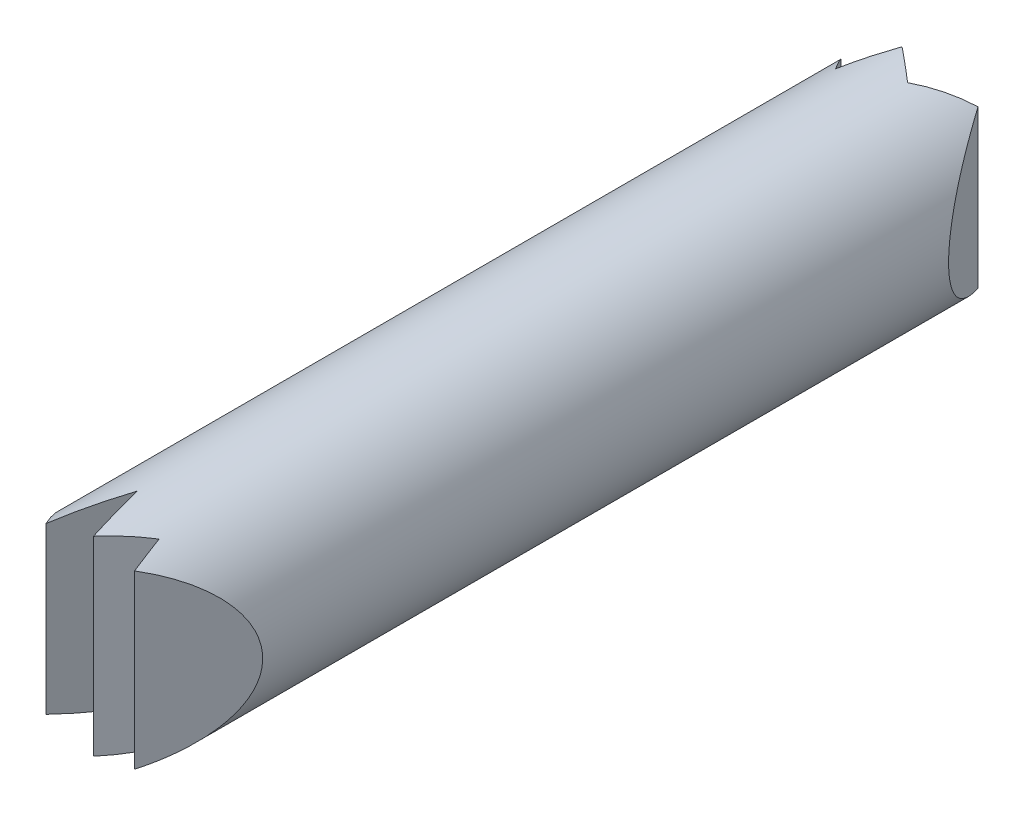
ISO-10303-21;
HEADER;
FILE_DESCRIPTION(('STEP AP214'),'2;1');
FILE_NAME('part.step','',(''),(''),'','','');
FILE_SCHEMA(('AUTOMOTIVE_DESIGN { 1 0 10303 214 1 1 1 1 }'));
ENDSEC;
DATA;
#1=APPLICATION_CONTEXT('core data for automotive mechanical design processes');
#2=APPLICATION_PROTOCOL_DEFINITION('international standard','automotive_design',2000,#1);
#3=PRODUCT_CONTEXT('',#1,'mechanical');
#4=PRODUCT('Part','Part','',(#3));
#5=PRODUCT_RELATED_PRODUCT_CATEGORY('part','',(#4));
#6=PRODUCT_DEFINITION_FORMATION('','',#4);
#7=PRODUCT_DEFINITION_CONTEXT('part definition',#1,'design');
#8=PRODUCT_DEFINITION('design','',#6,#7);
#9=PRODUCT_DEFINITION_SHAPE('','',#8);
#10=(LENGTH_UNIT() NAMED_UNIT(*) SI_UNIT(.MILLI.,.METRE.));
#11=(NAMED_UNIT(*) PLANE_ANGLE_UNIT() SI_UNIT($,.RADIAN.));
#12=(NAMED_UNIT(*) SI_UNIT($,.STERADIAN.) SOLID_ANGLE_UNIT());
#13=UNCERTAINTY_MEASURE_WITH_UNIT(LENGTH_MEASURE(1.E-05),#10,'distance_accuracy_value','');
#14=(GEOMETRIC_REPRESENTATION_CONTEXT(3) GLOBAL_UNCERTAINTY_ASSIGNED_CONTEXT((#13)) GLOBAL_UNIT_ASSIGNED_CONTEXT((#10,
#11,#12)) REPRESENTATION_CONTEXT('',''));
#15=CARTESIAN_POINT('',(0.,0.,0.));
#16=DIRECTION('',(0.,0.,1.));
#17=DIRECTION('',(1.,0.,0.));
#18=AXIS2_PLACEMENT_3D('',#15,#16,#17);
#19=CARTESIAN_POINT('',(-1.17875178837804,-5.,1.28429149256794));
#20=DIRECTION('',(0.887354961117826,0.,0.461086947309921));
#21=DIRECTION('',(0.461086947309921,0.,-0.887354961117826));
#22=AXIS2_PLACEMENT_3D('',#19,#20,#21);
#23=PLANE('',#22);
#24=CARTESIAN_POINT('',(0.,0.,-0.984198763871083));
#25=DIRECTION('',(0.887354961117826,0.,0.461086947309921));
#26=DIRECTION('',(-0.461086947309921,0.,0.887354961117826));
#27=AXIS2_PLACEMENT_3D('',#24,#25,#26);
#28=ELLIPSE('',#27,5.42197087682818,2.5);
#29=CARTESIAN_POINT('',(-1.17875178837804,-2.20466419696868,1.28429149256793));
#30=VERTEX_POINT('',#29);
#31=CARTESIAN_POINT('',(-0.583899881436,-2.43085600734783,0.139507859383393));
#32=VERTEX_POINT('',#31);
#33=EDGE_CURVE('E105',#30,#32,#28,.T.);
#34=ORIENTED_EDGE('',*,*,#33,.F.);
#35=DIRECTION('',(0.,1.,0.));
#36=VECTOR('',#35,1.);
#37=CARTESIAN_POINT('',(-1.17875178837804,-5.,1.28429149256794));
#38=LINE('',#37,#36);
#39=CARTESIAN_POINT('',(-1.17875178837804,2.20466419696868,1.28429149256793));
#40=VERTEX_POINT('',#39);
#41=EDGE_CURVE('E103',#30,#40,#38,.T.);
#42=ORIENTED_EDGE('',*,*,#41,.T.);
#43=CARTESIAN_POINT('',(0.,0.,-0.984198763871083));
#44=DIRECTION('',(0.887354961117826,0.,0.461086947309921));
#45=DIRECTION('',(-0.461086947309921,0.,0.887354961117826));
#46=AXIS2_PLACEMENT_3D('',#43,#44,#45);
#47=ELLIPSE('',#46,5.42197087682818,2.5);
#48=CARTESIAN_POINT('',(-0.583899881436,2.43085600734783,0.139507859383393));
#49=VERTEX_POINT('',#48);
#50=EDGE_CURVE('E19',#49,#40,#47,.T.);
#51=ORIENTED_EDGE('',*,*,#50,.F.);
#52=DIRECTION('',(0.,1.,0.));
#53=VECTOR('',#52,1.);
#54=CARTESIAN_POINT('',(-0.583899881435998,-5.,0.139507859383393));
#55=LINE('',#54,#53);
#56=EDGE_CURVE('E95',#49,#32,#55,.F.);
#57=ORIENTED_EDGE('',*,*,#56,.T.);
#58=EDGE_LOOP('',(#34,#42,#51,#57));
#59=FACE_BOUND('',#58,.T.);
#60=ADVANCED_FACE('F16',(#59),#23,.F.);
#61=CARTESIAN_POINT('',(-0.583899881435998,-5.,0.139507859383393));
#62=DIRECTION('',(-0.644364185846631,0.,0.76471876922056));
#63=DIRECTION('',(0.76471876922056,0.,0.644364185846631));
#64=AXIS2_PLACEMENT_3D('',#61,#62,#63);
#65=PLANE('',#64);
#66=CARTESIAN_POINT('',(0.,0.,0.631511177284091));
#67=DIRECTION('',(-0.644364185846631,0.,0.76471876922056));
#68=DIRECTION('',(0.76471876922056,0.,0.644364185846631));
#69=AXIS2_PLACEMENT_3D('',#66,#67,#68);
#70=ELLIPSE('',#69,3.26917567689378,2.5);
#71=CARTESIAN_POINT('',(0.350012461535052,2.47537699689768,0.926437238851908));
#72=VERTEX_POINT('',#71);
#73=EDGE_CURVE('E85',#72,#49,#70,.T.);
#74=ORIENTED_EDGE('',*,*,#73,.F.);
#75=DIRECTION('',(0.,1.,0.));
#76=VECTOR('',#75,1.);
#77=CARTESIAN_POINT('',(0.350012461535052,-5.,0.926437238851906));
#78=LINE('',#77,#76);
#79=CARTESIAN_POINT('',(0.350012461535052,-2.47537699689768,0.926437238851908));
#80=VERTEX_POINT('',#79);
#81=EDGE_CURVE('E143',#72,#80,#78,.F.);
#82=ORIENTED_EDGE('',*,*,#81,.T.);
#83=CARTESIAN_POINT('',(0.,0.,0.631511177284091));
#84=DIRECTION('',(-0.644364185846631,0.,0.76471876922056));
#85=DIRECTION('',(0.76471876922056,0.,0.644364185846631));
#86=AXIS2_PLACEMENT_3D('',#83,#84,#85);
#87=ELLIPSE('',#86,3.26917567689378,2.5);
#88=EDGE_CURVE('E96',#32,#80,#87,.T.);
#89=ORIENTED_EDGE('',*,*,#88,.F.);
#90=ORIENTED_EDGE('',*,*,#56,.F.);
#91=EDGE_LOOP('',(#74,#82,#89,#90));
#92=FACE_BOUND('',#91,.T.);
#93=ADVANCED_FACE('F106',(#92),#65,.F.);
#94=CARTESIAN_POINT('',(-1.75620779661867,-5.,0.568582985135875));
#95=DIRECTION('',(-0.778268632466615,0.,0.627931473744185));
#96=DIRECTION('',(0.627931473744185,0.,0.778268632466615));
#97=AXIS2_PLACEMENT_3D('',#94,#95,#96);
#98=PLANE('',#97);
#99=CARTESIAN_POINT('',(0.,0.,2.74525591419253));
#100=DIRECTION('',(-0.778268632466615,0.,0.627931473744185));
#101=DIRECTION('',(0.627931473744185,0.,0.778268632466615));
#102=AXIS2_PLACEMENT_3D('',#99,#100,#101);
#103=ELLIPSE('',#102,3.98132615505507,2.5);
#104=CARTESIAN_POINT('',(-1.75620779661867,1.77925101520156,0.568582985135872));
#105=VERTEX_POINT('',#104);
#106=EDGE_CURVE('E145',#40,#105,#103,.T.);
#107=ORIENTED_EDGE('',*,*,#106,.F.);
#108=ORIENTED_EDGE('',*,*,#41,.F.);
#109=CARTESIAN_POINT('',(0.,0.,2.74525591419253));
#110=DIRECTION('',(-0.778268632466615,0.,0.627931473744185));
#111=DIRECTION('',(0.627931473744185,0.,0.778268632466615));
#112=AXIS2_PLACEMENT_3D('',#109,#110,#111);
#113=ELLIPSE('',#112,3.98132615505507,2.5);
#114=CARTESIAN_POINT('',(-1.75620779661867,-1.77925101520156,0.568582985135872));
#115=VERTEX_POINT('',#114);
#116=EDGE_CURVE('E107',#115,#30,#113,.T.);
#117=ORIENTED_EDGE('',*,*,#116,.F.);
#118=DIRECTION('',(0.,1.,0.));
#119=VECTOR('',#118,1.);
#120=CARTESIAN_POINT('',(-1.75620779661867,-5.,0.568582985135874));
#121=LINE('',#120,#119);
#122=EDGE_CURVE('E151',#115,#105,#121,.T.);
#123=ORIENTED_EDGE('',*,*,#122,.T.);
#124=EDGE_LOOP('',(#107,#108,#117,#123));
#125=FACE_BOUND('',#124,.T.);
#126=ADVANCED_FACE('F148',(#125),#98,.F.);
#127=CARTESIAN_POINT('',(0.350012461535052,-5.,0.926437238851906));
#128=DIRECTION('',(0.595908512145978,0.,0.803052330269931));
#129=DIRECTION('',(0.803052330269931,0.,-0.595908512145978));
#130=AXIS2_PLACEMENT_3D('',#127,#128,#129);
#131=PLANE('',#130);
#132=CARTESIAN_POINT('',(0.,0.,1.18616552469823));
#133=DIRECTION('',(0.595908512145978,0.,0.803052330269931));
#134=DIRECTION('',(-0.803052330269931,0.,0.595908512145978));
#135=AXIS2_PLACEMENT_3D('',#132,#133,#134);
#136=ELLIPSE('',#135,3.11312215377007,2.5);
#137=CARTESIAN_POINT('',(1.41048644212027,-2.06410464768502,0.139507859383394));
#138=VERTEX_POINT('',#137);
#139=EDGE_CURVE('E141',#80,#138,#136,.T.);
#140=ORIENTED_EDGE('',*,*,#139,.F.);
#141=ORIENTED_EDGE('',*,*,#81,.F.);
#142=CARTESIAN_POINT('',(0.,0.,1.18616552469823));
#143=DIRECTION('',(0.595908512145978,0.,0.803052330269931));
#144=DIRECTION('',(-0.803052330269931,0.,0.595908512145978));
#145=AXIS2_PLACEMENT_3D('',#142,#143,#144);
#146=ELLIPSE('',#145,3.11312215377007,2.5);
#147=CARTESIAN_POINT('',(1.41048644212027,2.06410464768502,0.139507859383394));
#148=VERTEX_POINT('',#147);
#149=EDGE_CURVE('E90',#148,#72,#146,.T.);
#150=ORIENTED_EDGE('',*,*,#149,.F.);
#151=DIRECTION('',(0.,1.,0.));
#152=VECTOR('',#151,1.);
#153=CARTESIAN_POINT('',(1.41048644212027,-5.,0.139507859383393));
#154=LINE('',#153,#152);
#155=EDGE_CURVE('E155',#148,#138,#154,.F.);
#156=ORIENTED_EDGE('',*,*,#155,.T.);
#157=EDGE_LOOP('',(#140,#141,#150,#156));
#158=FACE_BOUND('',#157,.T.);
#159=ADVANCED_FACE('F165',(#158),#131,.F.);
#160=CARTESIAN_POINT('',(0.795917273819669,-5.,21.0153343800243));
#161=DIRECTION('',(0.955930514713206,0.,-0.293593002369172));
#162=DIRECTION('',(-0.293593002369172,0.,-0.955930514713206));
#163=AXIS2_PLACEMENT_3D('',#160,#161,#162);
#164=PLANE('',#163);
#165=CARTESIAN_POINT('',(0.,0.,18.4238502401031));
#166=DIRECTION('',(0.955930514713206,0.,-0.293593002369172));
#167=DIRECTION('',(0.293593002369172,0.,0.955930514713206));
#168=AXIS2_PLACEMENT_3D('',#165,#166,#167);
#169=ELLIPSE('',#168,8.51518932612852,2.5);
#170=CARTESIAN_POINT('',(1.08144621786722,-2.2539907004823,21.9450085488442));
#171=VERTEX_POINT('',#170);
#172=CARTESIAN_POINT('',(0.795917273819688,-2.36991892123664,21.0153343800243));
#173=VERTEX_POINT('',#172);
#174=EDGE_CURVE('E137',#171,#173,#169,.T.);
#175=ORIENTED_EDGE('',*,*,#174,.F.);
#176=DIRECTION('',(0.,1.,0.));
#177=VECTOR('',#176,1.);
#178=CARTESIAN_POINT('',(1.08144621786721,-5.,21.9450085488442));
#179=LINE('',#178,#177);
#180=CARTESIAN_POINT('',(1.08144621786722,2.2539907004823,21.9450085488442));
#181=VERTEX_POINT('',#180);
#182=EDGE_CURVE('E158',#171,#181,#179,.T.);
#183=ORIENTED_EDGE('',*,*,#182,.T.);
#184=CARTESIAN_POINT('',(0.,0.,18.4238502401031));
#185=DIRECTION('',(0.955930514713206,0.,-0.293593002369172));
#186=DIRECTION('',(0.293593002369172,0.,0.955930514713206));
#187=AXIS2_PLACEMENT_3D('',#184,#185,#186);
#188=ELLIPSE('',#187,8.51518932612852,2.5);
#189=CARTESIAN_POINT('',(0.795917273819688,2.36991892123664,21.0153343800243));
#190=VERTEX_POINT('',#189);
#191=EDGE_CURVE('E139',#190,#181,#188,.T.);
#192=ORIENTED_EDGE('',*,*,#191,.F.);
#193=DIRECTION('',(0.,1.,0.));
#194=VECTOR('',#193,1.);
#195=CARTESIAN_POINT('',(0.795917273819692,-5.,21.0153343800243));
#196=LINE('',#195,#194);
#197=EDGE_CURVE('E134',#190,#173,#196,.F.);
#198=ORIENTED_EDGE('',*,*,#197,.T.);
#199=EDGE_LOOP('',(#175,#183,#192,#198));
#200=FACE_BOUND('',#199,.T.);
#201=ADVANCED_FACE('F221',(#200),#164,.F.);
#202=CARTESIAN_POINT('',(0.,-5.,21.9450085488442));
#203=DIRECTION('',(-0.759638534696377,0.,-0.650345520938171));
#204=DIRECTION('',(-0.650345520938171,0.,0.759638534696377));
#205=AXIS2_PLACEMENT_3D('',#202,#203,#204);
#206=PLANE('',#205);
#207=CARTESIAN_POINT('',(0.,0.,21.9450085488442));
#208=DIRECTION('',(-0.759638534696377,0.,-0.650345520938171));
#209=DIRECTION('',(-0.650345520938171,0.,0.759638534696377));
#210=AXIS2_PLACEMENT_3D('',#207,#208,#209);
#211=ELLIPSE('',#210,3.84411042978134,2.5);
#212=CARTESIAN_POINT('',(0.,2.5,21.9450085488442));
#213=VERTEX_POINT('',#212);
#214=EDGE_CURVE('E34',#213,#190,#211,.T.);
#215=ORIENTED_EDGE('',*,*,#214,.F.);
#216=DIRECTION('',(0.,1.,0.));
#217=VECTOR('',#216,1.);
#218=CARTESIAN_POINT('',(0.,-5.,21.9450085488442));
#219=LINE('',#218,#217);
#220=CARTESIAN_POINT('',(0.,-2.5,21.9450085488442));
#221=VERTEX_POINT('',#220);
#222=EDGE_CURVE('E209',#213,#221,#219,.F.);
#223=ORIENTED_EDGE('',*,*,#222,.T.);
#224=CARTESIAN_POINT('',(0.,0.,21.9450085488442));
#225=DIRECTION('',(-0.759638534696377,0.,-0.650345520938171));
#226=DIRECTION('',(-0.650345520938171,0.,0.759638534696377));
#227=AXIS2_PLACEMENT_3D('',#224,#225,#226);
#228=ELLIPSE('',#227,3.84411042978134,2.5);
#229=EDGE_CURVE('E135',#173,#221,#228,.T.);
#230=ORIENTED_EDGE('',*,*,#229,.F.);
#231=ORIENTED_EDGE('',*,*,#197,.F.);
#232=EDGE_LOOP('',(#215,#223,#230,#231));
#233=FACE_BOUND('',#232,.T.);
#234=ADVANCED_FACE('F181',(#233),#206,.F.);
#235=CARTESIAN_POINT('',(-2.5,-5.,2.));
#236=DIRECTION('',(0.887354961117826,0.,0.461086947309921));
#237=DIRECTION('',(0.461086947309921,0.,-0.887354961117826));
#238=AXIS2_PLACEMENT_3D('',#235,#236,#237);
#239=PLANE('',#238);
#240=CARTESIAN_POINT('',(0.,0.,-2.81121275658985));
#241=DIRECTION('',(0.887354961117826,0.,0.461086947309921));
#242=DIRECTION('',(-0.461086947309921,0.,0.887354961117826));
#243=AXIS2_PLACEMENT_3D('',#240,#241,#242);
#244=ELLIPSE('',#243,5.42197087682818,2.5);
#245=EDGE_CURVE('E129',#105,#115,#244,.T.);
#246=ORIENTED_EDGE('',*,*,#245,.F.);
#247=ORIENTED_EDGE('',*,*,#122,.F.);
#248=EDGE_LOOP('',(#246,#247));
#249=FACE_BOUND('',#248,.T.);
#250=ADVANCED_FACE('F154',(#249),#239,.F.);
#251=CARTESIAN_POINT('',(1.41048644212027,-5.,0.139507859383393));
#252=DIRECTION('',(-0.862924473467786,0.,0.505332913127915));
#253=DIRECTION('',(0.505332913127915,0.,0.862924473467786));
#254=AXIS2_PLACEMENT_3D('',#251,#252,#253);
#255=PLANE('',#254);
#256=CARTESIAN_POINT('',(0.,0.,-2.26908900573311));
#257=DIRECTION('',(-0.862924473467786,0.,0.505332913127915));
#258=DIRECTION('',(0.505332913127915,0.,0.862924473467786));
#259=AXIS2_PLACEMENT_3D('',#256,#257,#258);
#260=ELLIPSE('',#259,4.94723366527914,2.5);
#261=EDGE_CURVE('E127',#138,#148,#260,.T.);
#262=ORIENTED_EDGE('',*,*,#261,.F.);
#263=ORIENTED_EDGE('',*,*,#155,.F.);
#264=EDGE_LOOP('',(#262,#263));
#265=FACE_BOUND('',#264,.T.);
#266=ADVANCED_FACE('F169',(#265),#255,.F.);
#267=CARTESIAN_POINT('',(1.08144621786721,-5.,21.9450085488442));
#268=DIRECTION('',(-0.80794456540425,0.,-0.589258499500633));
#269=DIRECTION('',(-0.589258499500633,0.,0.80794456540425));
#270=AXIS2_PLACEMENT_3D('',#267,#268,#269);
#271=PLANE('',#270);
#272=ORIENTED_EDGE('',*,*,#182,.F.);
#273=CARTESIAN_POINT('',(0.,0.,23.4278019158355));
#274=DIRECTION('',(-0.80794456540425,0.,-0.589258499500633));
#275=DIRECTION('',(-0.589258499500633,0.,0.80794456540425));
#276=AXIS2_PLACEMENT_3D('',#273,#274,#275);
#277=ELLIPSE('',#276,4.24262017793315,2.5);
#278=EDGE_CURVE('E124',#181,#171,#277,.T.);
#279=ORIENTED_EDGE('',*,*,#278,.F.);
#280=EDGE_LOOP('',(#272,#279));
#281=FACE_BOUND('',#280,.T.);
#282=ADVANCED_FACE('F171',(#281),#271,.F.);
#283=CARTESIAN_POINT('',(-2.5,-5.,20.));
#284=DIRECTION('',(0.839886067738296,0.,-0.542762741185412));
#285=DIRECTION('',(-0.542762741185412,0.,-0.839886067738296));
#286=AXIS2_PLACEMENT_3D('',#283,#284,#285);
#287=PLANE('',#286);
#288=DIRECTION('',(0.,1.,0.));
#289=VECTOR('',#288,1.);
#290=CARTESIAN_POINT('',(-1.24306978987931,-5.,21.9450085488442));
#291=LINE('',#290,#289);
#292=CARTESIAN_POINT('',(-1.24306978987931,-2.16904990663871,21.9450085488442));
#293=VERTEX_POINT('',#292);
#294=CARTESIAN_POINT('',(-1.24306978987931,2.16904990663871,21.9450085488442));
#295=VERTEX_POINT('',#294);
#296=EDGE_CURVE('E204',#293,#295,#291,.T.);
#297=ORIENTED_EDGE('',*,*,#296,.T.);
#298=CARTESIAN_POINT('',(0.,0.,23.8685691003032));
#299=DIRECTION('',(0.839886067738296,0.,-0.542762741185412));
#300=DIRECTION('',(0.542762741185412,0.,0.839886067738296));
#301=AXIS2_PLACEMENT_3D('',#298,#299,#300);
#302=ELLIPSE('',#301,4.60606414239105,2.5);
#303=EDGE_CURVE('E115',#293,#295,#302,.T.);
#304=ORIENTED_EDGE('',*,*,#303,.F.);
#305=EDGE_LOOP('',(#297,#304));
#306=FACE_BOUND('',#305,.T.);
#307=ADVANCED_FACE('F178',(#306),#287,.F.);
#308=CARTESIAN_POINT('',(-1.24306978987931,-5.,21.9450085488442));
#309=DIRECTION('',(-0.912668164503576,0.,-0.408701384266893));
#310=DIRECTION('',(-0.408701384266893,0.,0.912668164503576));
#311=AXIS2_PLACEMENT_3D('',#308,#309,#310);
#312=PLANE('',#311);
#313=CARTESIAN_POINT('',(0.,0.,19.1691182114184));
#314=DIRECTION('',(-0.912668164503576,0.,-0.408701384266893));
#315=DIRECTION('',(-0.408701384266893,0.,0.912668164503576));
#316=AXIS2_PLACEMENT_3D('',#313,#314,#315);
#317=ELLIPSE('',#316,6.11693548453321,2.5);
#318=CARTESIAN_POINT('',(-0.505712816335389,2.44831667628886,20.2984219172981));
#319=VERTEX_POINT('',#318);
#320=EDGE_CURVE('E25',#295,#319,#317,.T.);
#321=ORIENTED_EDGE('',*,*,#320,.F.);
#322=ORIENTED_EDGE('',*,*,#296,.F.);
#323=CARTESIAN_POINT('',(0.,0.,19.1691182114184));
#324=DIRECTION('',(-0.912668164503576,0.,-0.408701384266893));
#325=DIRECTION('',(-0.408701384266893,0.,0.912668164503576));
#326=AXIS2_PLACEMENT_3D('',#323,#324,#325);
#327=ELLIPSE('',#326,6.11693548453321,2.5);
#328=CARTESIAN_POINT('',(-0.505712816335389,-2.44831667628886,20.2984219172981));
#329=VERTEX_POINT('',#328);
#330=EDGE_CURVE('E118',#329,#293,#327,.T.);
#331=ORIENTED_EDGE('',*,*,#330,.F.);
#332=DIRECTION('',(0.,1.,0.));
#333=VECTOR('',#332,1.);
#334=CARTESIAN_POINT('',(-0.505712816335391,-5.,20.2984219172981));
#335=LINE('',#334,#333);
#336=EDGE_CURVE('E132',#329,#319,#335,.T.);
#337=ORIENTED_EDGE('',*,*,#336,.T.);
#338=EDGE_LOOP('',(#321,#322,#331,#337));
#339=FACE_BOUND('',#338,.T.);
#340=ADVANCED_FACE('F190',(#339),#312,.F.);
#341=CARTESIAN_POINT('',(-0.505712816335391,-5.,20.2984219172981));
#342=DIRECTION('',(0.955930514713206,0.,-0.293593002369172));
#343=DIRECTION('',(-0.293593002369172,0.,-0.955930514713206));
#344=AXIS2_PLACEMENT_3D('',#341,#342,#343);
#345=PLANE('',#344);
#346=CARTESIAN_POINT('',(0.,0.,21.9450085488442));
#347=DIRECTION('',(0.955930514713206,0.,-0.293593002369172));
#348=DIRECTION('',(0.293593002369172,0.,0.955930514713206));
#349=AXIS2_PLACEMENT_3D('',#346,#347,#348);
#350=ELLIPSE('',#349,8.51518932612852,2.5);
#351=EDGE_CURVE('E121',#221,#329,#350,.T.);
#352=ORIENTED_EDGE('',*,*,#351,.F.);
#353=ORIENTED_EDGE('',*,*,#222,.F.);
#354=CARTESIAN_POINT('',(0.,0.,21.9450085488442));
#355=DIRECTION('',(0.955930514713206,0.,-0.293593002369172));
#356=DIRECTION('',(0.293593002369172,0.,0.955930514713206));
#357=AXIS2_PLACEMENT_3D('',#354,#355,#356);
#358=ELLIPSE('',#357,8.51518932612852,2.5);
#359=EDGE_CURVE('E10',#319,#213,#358,.T.);
#360=ORIENTED_EDGE('',*,*,#359,.F.);
#361=ORIENTED_EDGE('',*,*,#336,.F.);
#362=EDGE_LOOP('',(#352,#353,#360,#361));
#363=FACE_BOUND('',#362,.T.);
#364=ADVANCED_FACE('F184',(#363),#345,.F.);
#365=CARTESIAN_POINT('',(0.,0.,100.));
#366=DIRECTION('',(0.,0.,1.));
#367=DIRECTION('',(1.,0.,0.));
#368=AXIS2_PLACEMENT_3D('',#365,#366,#367);
#369=CYLINDRICAL_SURFACE('',#368,2.5);
#370=ORIENTED_EDGE('',*,*,#214,.T.);
#371=ORIENTED_EDGE('',*,*,#191,.T.);
#372=ORIENTED_EDGE('',*,*,#278,.T.);
#373=ORIENTED_EDGE('',*,*,#174,.T.);
#374=ORIENTED_EDGE('',*,*,#229,.T.);
#375=ORIENTED_EDGE('',*,*,#351,.T.);
#376=ORIENTED_EDGE('',*,*,#330,.T.);
#377=ORIENTED_EDGE('',*,*,#303,.T.);
#378=ORIENTED_EDGE('',*,*,#320,.T.);
#379=ORIENTED_EDGE('',*,*,#359,.T.);
#380=EDGE_LOOP('',(#370,#371,#372,#373,#374,#375,#376,#377,#378,#379));
#381=FACE_BOUND('',#380,.T.);
#382=ORIENTED_EDGE('',*,*,#50,.T.);
#383=ORIENTED_EDGE('',*,*,#106,.T.);
#384=ORIENTED_EDGE('',*,*,#245,.T.);
#385=ORIENTED_EDGE('',*,*,#116,.T.);
#386=ORIENTED_EDGE('',*,*,#33,.T.);
#387=ORIENTED_EDGE('',*,*,#88,.T.);
#388=ORIENTED_EDGE('',*,*,#139,.T.);
#389=ORIENTED_EDGE('',*,*,#261,.T.);
#390=ORIENTED_EDGE('',*,*,#149,.T.);
#391=ORIENTED_EDGE('',*,*,#73,.T.);
#392=EDGE_LOOP('',(#382,#383,#384,#385,#386,#387,#388,#389,#390,#391));
#393=FACE_BOUND('',#392,.T.);
#394=ADVANCED_FACE('F87',(#381,#393),#369,.T.);
#395=CLOSED_SHELL('',(#60,#93,#126,#159,#201,#234,#250,#266,#282,#307,#340,#364,#394));
#396=MANIFOLD_SOLID_BREP('B1',#395);
#397=ADVANCED_BREP_SHAPE_REPRESENTATION('',(#18,#396),#14);
#398=SHAPE_DEFINITION_REPRESENTATION(#9,#397);
ENDSEC;
END-ISO-10303-21;
